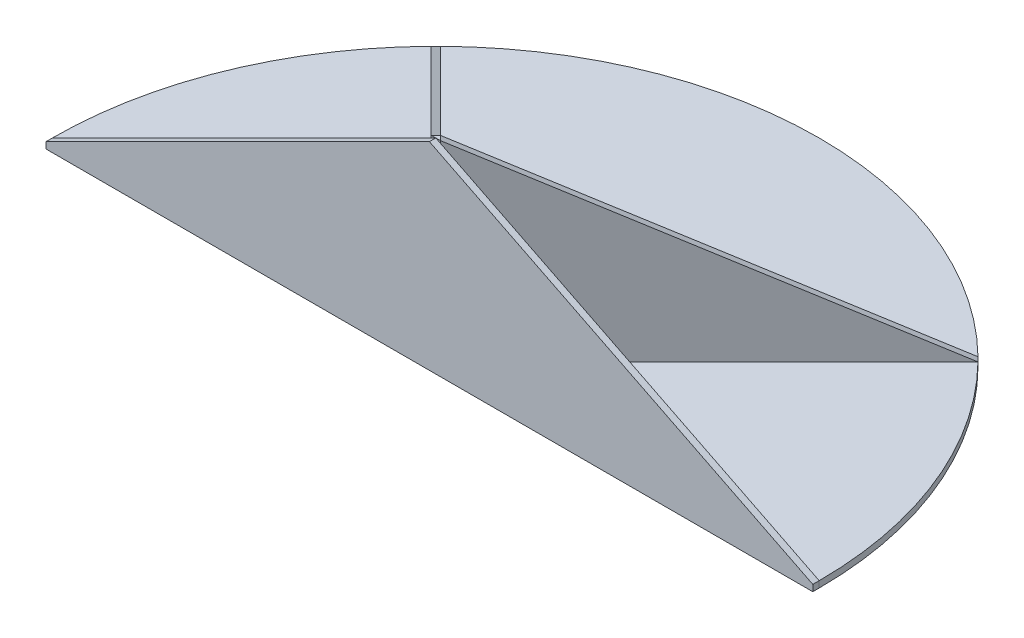
ISO-10303-21;
HEADER;
FILE_DESCRIPTION(('STEP AP214'),'2;1');
FILE_NAME('part.step','',(''),(''),'','','');
FILE_SCHEMA(('AUTOMOTIVE_DESIGN { 1 0 10303 214 1 1 1 1 }'));
ENDSEC;
DATA;
#1=APPLICATION_CONTEXT('core data for automotive mechanical design processes');
#2=APPLICATION_PROTOCOL_DEFINITION('international standard','automotive_design',2000,#1);
#3=PRODUCT_CONTEXT('',#1,'mechanical');
#4=PRODUCT('Part','Part','',(#3));
#5=PRODUCT_RELATED_PRODUCT_CATEGORY('part','',(#4));
#6=PRODUCT_DEFINITION_FORMATION('','',#4);
#7=PRODUCT_DEFINITION_CONTEXT('part definition',#1,'design');
#8=PRODUCT_DEFINITION('design','',#6,#7);
#9=PRODUCT_DEFINITION_SHAPE('','',#8);
#10=(LENGTH_UNIT() NAMED_UNIT(*) SI_UNIT(.MILLI.,.METRE.));
#11=(NAMED_UNIT(*) PLANE_ANGLE_UNIT() SI_UNIT($,.RADIAN.));
#12=(NAMED_UNIT(*) SI_UNIT($,.STERADIAN.) SOLID_ANGLE_UNIT());
#13=UNCERTAINTY_MEASURE_WITH_UNIT(LENGTH_MEASURE(1.E-05),#10,'distance_accuracy_value','');
#14=(GEOMETRIC_REPRESENTATION_CONTEXT(3) GLOBAL_UNCERTAINTY_ASSIGNED_CONTEXT((#13)) GLOBAL_UNIT_ASSIGNED_CONTEXT((#10,
#11,#12)) REPRESENTATION_CONTEXT('',''));
#15=CARTESIAN_POINT('',(0.,0.,0.));
#16=DIRECTION('',(0.,0.,1.));
#17=DIRECTION('',(1.,0.,0.));
#18=AXIS2_PLACEMENT_3D('',#15,#16,#17);
#19=CARTESIAN_POINT('',(0.,150.,0.));
#20=DIRECTION('',(0.,1.,0.));
#21=DIRECTION('',(0.,0.,1.));
#22=AXIS2_PLACEMENT_3D('',#19,#20,#21);
#23=PLANE('',#22);
#24=DIRECTION('',(0.707106781186546,0.,-0.707106781186549));
#25=VECTOR('',#24,1.);
#26=CARTESIAN_POINT('',(145.7312358923,150.,150.733260892299));
#27=LINE('',#26,#25);
#28=CARTESIAN_POINT('',(296.464496784599,150.,0.));
#29=VERTEX_POINT('',#28);
#30=CARTESIAN_POINT('',(299.999999999999,150.,-3.53550321540047));
#31=VERTEX_POINT('',#30);
#32=EDGE_CURVE('E562',#29,#31,#27,.T.);
#33=ORIENTED_EDGE('',*,*,#32,.F.);
#34=DIRECTION('',(1.,0.,0.));
#35=VECTOR('',#34,1.);
#36=CARTESIAN_POINT('',(0.,150.,0.));
#37=LINE('',#36,#35);
#38=CARTESIAN_POINT('',(300.,150.,0.));
#39=VERTEX_POINT('',#38);
#40=EDGE_CURVE('E87',#29,#39,#37,.T.);
#41=ORIENTED_EDGE('',*,*,#40,.T.);
#42=CARTESIAN_POINT('',(303.5355032154,150.,0.));
#43=VERTEX_POINT('',#42);
#44=EDGE_CURVE('E600',#39,#43,#37,.T.);
#45=ORIENTED_EDGE('',*,*,#44,.T.);
#46=DIRECTION('',(-0.707106781186549,0.,-0.707106781186546));
#47=VECTOR('',#46,1.);
#48=CARTESIAN_POINT('',(454.2687641077,150.,150.7332608923));
#49=LINE('',#48,#47);
#50=EDGE_CURVE('E554',#43,#31,#49,.T.);
#51=ORIENTED_EDGE('',*,*,#50,.T.);
#52=EDGE_LOOP('',(#33,#41,#45,#51));
#53=FACE_BOUND('',#52,.T.);
#54=ADVANCED_FACE('F36',(#53),#23,.T.);
#55=CARTESIAN_POINT('',(300.,0.,0.));
#56=DIRECTION('',(0.,-1.,0.));
#57=DIRECTION('',(0.,0.,-1.));
#58=AXIS2_PLACEMENT_3D('',#55,#56,#57);
#59=PLANE('',#58);
#60=DIRECTION('',(0.707106781186549,0.,0.707106781186546));
#61=VECTOR('',#60,1.);
#62=CARTESIAN_POINT('',(148.131566755635,0.,-148.131566755636));
#63=LINE('',#62,#61);
#64=CARTESIAN_POINT('',(86.0073295606741,0.,-210.255803950606));
#65=VERTEX_POINT('',#64);
#66=CARTESIAN_POINT('',(296.263133511271,0.,0.));
#67=VERTEX_POINT('',#66);
#68=EDGE_CURVE('E215',#65,#67,#63,.T.);
#69=ORIENTED_EDGE('',*,*,#68,.F.);
#70=CARTESIAN_POINT('',(300.,0.,0.));
#71=DIRECTION('',(0.,1.,0.));
#72=DIRECTION('',(0.,0.,-1.));
#73=AXIS2_PLACEMENT_3D('',#70,#71,#72);
#74=CIRCLE('',#73,300.);
#75=CARTESIAN_POINT('',(0.,0.,0.));
#76=VERTEX_POINT('',#75);
#77=EDGE_CURVE('E143',#65,#76,#74,.T.);
#78=ORIENTED_EDGE('',*,*,#77,.T.);
#79=DIRECTION('',(1.,0.,0.));
#80=VECTOR('',#79,1.);
#81=CARTESIAN_POINT('',(0.,0.,0.));
#82=LINE('',#81,#80);
#83=EDGE_CURVE('E145',#76,#67,#82,.T.);
#84=ORIENTED_EDGE('',*,*,#83,.T.);
#85=EDGE_LOOP('',(#69,#78,#84));
#86=FACE_BOUND('',#85,.T.);
#87=ADVANCED_FACE('F226',(#86),#59,.F.);
#88=CARTESIAN_POINT('',(600.,0.,0.));
#89=VERTEX_POINT('',#88);
#90=CARTESIAN_POINT('',(513.892420268064,0.,-210.356917052589));
#91=VERTEX_POINT('',#90);
#92=EDGE_CURVE('E159',#89,#91,#74,.T.);
#93=ORIENTED_EDGE('',*,*,#92,.T.);
#94=DIRECTION('',(-0.707106781186546,0.,0.707106781186549));
#95=VECTOR('',#94,1.);
#96=CARTESIAN_POINT('',(151.767751607701,0.,151.7677516077));
#97=LINE('',#96,#95);
#98=CARTESIAN_POINT('',(303.5355032154,0.,0.));
#99=VERTEX_POINT('',#98);
#100=EDGE_CURVE('E205',#91,#99,#97,.T.);
#101=ORIENTED_EDGE('',*,*,#100,.T.);
#102=EDGE_CURVE('E56',#99,#89,#82,.T.);
#103=ORIENTED_EDGE('',*,*,#102,.T.);
#104=EDGE_LOOP('',(#93,#101,#103));
#105=FACE_BOUND('',#104,.T.);
#106=ADVANCED_FACE('F206',(#105),#59,.F.);
#107=CARTESIAN_POINT('',(300.,0.,-15.));
#108=DIRECTION('',(0.,-1.,0.));
#109=DIRECTION('',(0.,0.,-1.));
#110=AXIS2_PLACEMENT_3D('',#107,#108,#109);
#111=CIRCLE('',#110,4.99999999999999);
#112=CARTESIAN_POINT('',(300.,0.,-20.));
#113=VERTEX_POINT('',#112);
#114=EDGE_CURVE('E624',#113,#113,#111,.F.);
#115=ORIENTED_EDGE('',*,*,#114,.F.);
#116=EDGE_LOOP('',(#115));
#117=FACE_BOUND('',#116,.T.);
#118=DIRECTION('',(-0.707106781186546,0.,0.707106781186549));
#119=VECTOR('',#118,1.);
#120=CARTESIAN_POINT('',(148.2322483923,0.,148.232248392299));
#121=LINE('',#120,#119);
#122=CARTESIAN_POINT('',(510.356917052626,0.,-213.892420268028));
#123=VERTEX_POINT('',#122);
#124=CARTESIAN_POINT('',(299.999999999999,0.,-3.53550321540041));
#125=VERTEX_POINT('',#124);
#126=EDGE_CURVE('E295',#123,#125,#121,.T.);
#127=ORIENTED_EDGE('',*,*,#126,.F.);
#128=CARTESIAN_POINT('',(89.6430829473671,0.,-213.892420268021));
#129=VERTEX_POINT('',#128);
#130=EDGE_CURVE('E155',#123,#129,#74,.T.);
#131=ORIENTED_EDGE('',*,*,#130,.T.);
#132=DIRECTION('',(0.707106781186549,0.,0.707106781186546));
#133=VECTOR('',#132,1.);
#134=CARTESIAN_POINT('',(151.767751607699,0.,-151.7677516077));
#135=LINE('',#134,#133);
#136=EDGE_CURVE('E292',#129,#125,#135,.T.);
#137=ORIENTED_EDGE('',*,*,#136,.T.);
#138=EDGE_LOOP('',(#127,#131,#137));
#139=FACE_BOUND('',#138,.T.);
#140=ADVANCED_FACE('F325',(#117,#139),#59,.F.);
#141=CARTESIAN_POINT('',(0.,0.,0.));
#142=DIRECTION('',(0.,0.,1.));
#143=DIRECTION('',(1.,0.,0.));
#144=AXIS2_PLACEMENT_3D('',#141,#142,#143);
#145=PLANE('',#144);
#146=DIRECTION('',(0.,-1.,0.));
#147=VECTOR('',#146,1.);
#148=CARTESIAN_POINT('',(296.263133511271,150.,0.));
#149=LINE('',#148,#147);
#150=CARTESIAN_POINT('',(296.263133511271,148.131566755636,0.));
#151=VERTEX_POINT('',#150);
#152=EDGE_CURVE('E238',#151,#67,#149,.T.);
#153=ORIENTED_EDGE('',*,*,#152,.T.);
#154=ORIENTED_EDGE('',*,*,#83,.F.);
#155=DIRECTION('',(-0.894427190999916,-0.447213595499958,0.));
#156=VECTOR('',#155,1.);
#157=CARTESIAN_POINT('',(300.,150.,0.));
#158=LINE('',#157,#156);
#159=EDGE_CURVE('E132',#151,#76,#158,.T.);
#160=ORIENTED_EDGE('',*,*,#159,.F.);
#161=EDGE_LOOP('',(#153,#154,#160));
#162=FACE_BOUND('',#161,.T.);
#163=ADVANCED_FACE('F236',(#162),#145,.F.);
#164=CARTESIAN_POINT('',(300.,-5.,0.));
#165=DIRECTION('',(0.,1.,0.));
#166=DIRECTION('',(0.,0.,1.));
#167=AXIS2_PLACEMENT_3D('',#164,#165,#166);
#168=CYLINDRICAL_SURFACE('',#167,300.);
#169=ORIENTED_EDGE('',*,*,#92,.F.);
#170=DIRECTION('',(0.,1.,0.));
#171=VECTOR('',#170,1.);
#172=CARTESIAN_POINT('',(600.,-5.,0.));
#173=LINE('',#172,#171);
#174=CARTESIAN_POINT('',(600.,-5.,0.));
#175=VERTEX_POINT('',#174);
#176=EDGE_CURVE('E11',#175,#89,#173,.T.);
#177=ORIENTED_EDGE('',*,*,#176,.F.);
#178=CARTESIAN_POINT('',(300.,-5.,0.));
#179=DIRECTION('',(0.,1.,0.));
#180=DIRECTION('',(0.,0.,-1.));
#181=AXIS2_PLACEMENT_3D('',#178,#179,#180);
#182=CIRCLE('',#181,300.);
#183=CARTESIAN_POINT('',(0.,-5.,0.));
#184=VERTEX_POINT('',#183);
#185=EDGE_CURVE('E115',#175,#184,#182,.T.);
#186=ORIENTED_EDGE('',*,*,#185,.T.);
#187=DIRECTION('',(0.,1.,0.));
#188=VECTOR('',#187,1.);
#189=CARTESIAN_POINT('',(0.,-5.,0.));
#190=LINE('',#189,#188);
#191=EDGE_CURVE('E48',#184,#76,#190,.T.);
#192=ORIENTED_EDGE('',*,*,#191,.T.);
#193=ORIENTED_EDGE('',*,*,#77,.F.);
#194=CARTESIAN_POINT('',(300.,0.,0.));
#195=DIRECTION('',(0.,-1.,0.));
#196=DIRECTION('',(-0.713307463246567,0.,-0.700851241617469));
#197=AXIS2_PLACEMENT_3D('',#194,#195,#196);
#198=CIRCLE('',#197,300.);
#199=CARTESIAN_POINT('',(86.1077780252574,0.,-210.356719713735));
#200=VERTEX_POINT('',#199);
#201=EDGE_CURVE('E248',#65,#200,#198,.T.);
#202=ORIENTED_EDGE('',*,*,#201,.T.);
#203=CARTESIAN_POINT('',(300.,0.,0.));
#204=DIRECTION('',(0.,-1.,0.));
#205=DIRECTION('',(-0.712974738098335,0.,-0.701189719572108));
#206=AXIS2_PLACEMENT_3D('',#203,#204,#205);
#207=CIRCLE('',#206,300.);
#208=CARTESIAN_POINT('',(86.1926777252267,0.,-210.442709888448));
#209=VERTEX_POINT('',#208);
#210=EDGE_CURVE('E555',#200,#209,#207,.T.);
#211=ORIENTED_EDGE('',*,*,#210,.T.);
#212=CARTESIAN_POINT('',(87.7673042066446,0.,-212.031325129767));
#213=DIRECTION('',(-0.703817272243144,0.,0.710381057807864));
#214=VECTOR('',#213,1.);
#215=LINE('',#212,#214);
#216=CARTESIAN_POINT('',(87.7673042066445,0.,-212.031325129767));
#217=VERTEX_POINT('',#216);
#218=EDGE_CURVE('E305',#217,#209,#215,.T.);
#219=ORIENTED_EDGE('',*,*,#218,.F.);
#220=CARTESIAN_POINT('',(300.,0.,0.));
#221=DIRECTION('',(0.,-1.,0.));
#222=DIRECTION('',(-0.707442319311179,0.,-0.706771083765897));
#223=AXIS2_PLACEMENT_3D('',#220,#221,#222);
#224=CIRCLE('',#223,300.);
#225=EDGE_CURVE('E167',#217,#129,#224,.T.);
#226=ORIENTED_EDGE('',*,*,#225,.T.);
#227=ORIENTED_EDGE('',*,*,#130,.F.);
#228=CARTESIAN_POINT('',(512.132034355963,0.,-212.132034355966));
#229=DIRECTION('',(-0.710046921335167,0.,-0.70415436482525));
#230=VECTOR('',#229,1.);
#231=LINE('',#228,#230);
#232=CARTESIAN_POINT('',(512.132034355963,0.,-212.132034355966));
#233=VERTEX_POINT('',#232);
#234=EDGE_CURVE('E181',#233,#123,#231,.T.);
#235=ORIENTED_EDGE('',*,*,#234,.F.);
#236=CARTESIAN_POINT('',(300.,0.,0.));
#237=DIRECTION('',(0.,-1.,0.));
#238=DIRECTION('',(0.707106781186556,0.,-0.707106781186539));
#239=AXIS2_PLACEMENT_3D('',#236,#237,#238);
#240=CIRCLE('',#239,300.);
#241=EDGE_CURVE('E193',#233,#91,#240,.T.);
#242=ORIENTED_EDGE('',*,*,#241,.T.);
#243=EDGE_LOOP('',(#169,#177,#186,#192,#193,#202,#211,#219,#226,#227,#235,#242));
#244=FACE_BOUND('',#243,.T.);
#245=ADVANCED_FACE('F38',(#244),#168,.T.);
#246=CARTESIAN_POINT('',(300.,-5.,0.));
#247=DIRECTION('',(0.,-1.,0.));
#248=DIRECTION('',(0.,0.,-1.));
#249=AXIS2_PLACEMENT_3D('',#246,#247,#248);
#250=PLANE('',#249);
#251=CARTESIAN_POINT('',(300.,-5.,-15.));
#252=DIRECTION('',(0.,-1.,0.));
#253=DIRECTION('',(0.,0.,-1.));
#254=AXIS2_PLACEMENT_3D('',#251,#252,#253);
#255=CIRCLE('',#254,4.99999999999999);
#256=CARTESIAN_POINT('',(300.,-5.,-20.));
#257=VERTEX_POINT('',#256);
#258=EDGE_CURVE('E626',#257,#257,#255,.T.);
#259=ORIENTED_EDGE('',*,*,#258,.F.);
#260=EDGE_LOOP('',(#259));
#261=FACE_BOUND('',#260,.T.);
#262=ORIENTED_EDGE('',*,*,#185,.F.);
#263=DIRECTION('',(0.,0.,-1.));
#264=VECTOR('',#263,1.);
#265=CARTESIAN_POINT('',(600.,-5.,5.));
#266=LINE('',#265,#264);
#267=CARTESIAN_POINT('',(600.,-5.,5.));
#268=VERTEX_POINT('',#267);
#269=EDGE_CURVE('E112',#268,#175,#266,.T.);
#270=ORIENTED_EDGE('',*,*,#269,.F.);
#271=DIRECTION('',(1.,0.,0.));
#272=VECTOR('',#271,1.);
#273=CARTESIAN_POINT('',(600.,-5.,5.));
#274=LINE('',#273,#272);
#275=CARTESIAN_POINT('',(0.,-5.,5.));
#276=VERTEX_POINT('',#275);
#277=EDGE_CURVE('E102',#276,#268,#274,.T.);
#278=ORIENTED_EDGE('',*,*,#277,.F.);
#279=DIRECTION('',(0.,0.,-1.));
#280=VECTOR('',#279,1.);
#281=CARTESIAN_POINT('',(0.,-5.,5.));
#282=LINE('',#281,#280);
#283=EDGE_CURVE('E118',#276,#184,#282,.T.);
#284=ORIENTED_EDGE('',*,*,#283,.T.);
#285=EDGE_LOOP('',(#262,#270,#278,#284));
#286=FACE_BOUND('',#285,.T.);
#287=ADVANCED_FACE('F113',(#261,#286),#250,.T.);
#288=ORIENTED_EDGE('',*,*,#102,.F.);
#289=DIRECTION('',(0.,-1.,0.));
#290=VECTOR('',#289,1.);
#291=CARTESIAN_POINT('',(303.5355032154,150.,0.));
#292=LINE('',#291,#290);
#293=CARTESIAN_POINT('',(303.5355032154,148.2322483923,0.));
#294=VERTEX_POINT('',#293);
#295=EDGE_CURVE('E221',#294,#99,#292,.T.);
#296=ORIENTED_EDGE('',*,*,#295,.F.);
#297=DIRECTION('',(-0.894427190999916,0.447213595499958,0.));
#298=VECTOR('',#297,1.);
#299=CARTESIAN_POINT('',(300.,150.,0.));
#300=LINE('',#299,#298);
#301=EDGE_CURVE('E133',#89,#294,#300,.T.);
#302=ORIENTED_EDGE('',*,*,#301,.F.);
#303=EDGE_LOOP('',(#288,#296,#302));
#304=FACE_BOUND('',#303,.T.);
#305=ADVANCED_FACE('F219',(#304),#145,.F.);
#306=CARTESIAN_POINT('',(300.,150.,5.));
#307=DIRECTION('',(0.447213595499958,-0.894427190999916,0.));
#308=DIRECTION('',(0.894427190999916,0.447213595499958,0.));
#309=AXIS2_PLACEMENT_3D('',#306,#307,#308);
#310=PLANE('',#309);
#311=EDGE_CURVE('E128',#39,#151,#158,.T.);
#312=ORIENTED_EDGE('',*,*,#311,.T.);
#313=ORIENTED_EDGE('',*,*,#159,.T.);
#314=DIRECTION('',(0.,0.,-1.));
#315=VECTOR('',#314,1.);
#316=CARTESIAN_POINT('',(0.,0.,5.));
#317=LINE('',#316,#315);
#318=CARTESIAN_POINT('',(0.,0.,5.));
#319=VERTEX_POINT('',#318);
#320=EDGE_CURVE('E141',#319,#76,#317,.T.);
#321=ORIENTED_EDGE('',*,*,#320,.F.);
#322=DIRECTION('',(-0.894427190999916,-0.447213595499958,0.));
#323=VECTOR('',#322,1.);
#324=CARTESIAN_POINT('',(300.,150.,5.));
#325=LINE('',#324,#323);
#326=CARTESIAN_POINT('',(300.,150.,5.));
#327=VERTEX_POINT('',#326);
#328=EDGE_CURVE('E136',#327,#319,#325,.T.);
#329=ORIENTED_EDGE('',*,*,#328,.F.);
#330=DIRECTION('',(0.,0.,-1.));
#331=VECTOR('',#330,1.);
#332=CARTESIAN_POINT('',(300.,150.,5.));
#333=LINE('',#332,#331);
#334=EDGE_CURVE('E124',#327,#39,#333,.T.);
#335=ORIENTED_EDGE('',*,*,#334,.T.);
#336=EDGE_LOOP('',(#312,#313,#321,#329,#335));
#337=FACE_BOUND('',#336,.T.);
#338=ADVANCED_FACE('F308',(#337),#310,.F.);
#339=CARTESIAN_POINT('',(0.,0.,5.));
#340=DIRECTION('',(1.,0.,0.));
#341=DIRECTION('',(0.,0.,-1.));
#342=AXIS2_PLACEMENT_3D('',#339,#340,#341);
#343=PLANE('',#342);
#344=ORIENTED_EDGE('',*,*,#191,.F.);
#345=ORIENTED_EDGE('',*,*,#283,.F.);
#346=DIRECTION('',(0.,-1.,0.));
#347=VECTOR('',#346,1.);
#348=CARTESIAN_POINT('',(0.,0.,5.));
#349=LINE('',#348,#347);
#350=EDGE_CURVE('E96',#319,#276,#349,.T.);
#351=ORIENTED_EDGE('',*,*,#350,.F.);
#352=ORIENTED_EDGE('',*,*,#320,.T.);
#353=EDGE_LOOP('',(#344,#345,#351,#352));
#354=FACE_BOUND('',#353,.T.);
#355=ADVANCED_FACE('F241',(#354),#343,.F.);
#356=CARTESIAN_POINT('',(600.,0.,5.));
#357=DIRECTION('',(-1.,0.,0.));
#358=DIRECTION('',(0.,0.,1.));
#359=AXIS2_PLACEMENT_3D('',#356,#357,#358);
#360=PLANE('',#359);
#361=ORIENTED_EDGE('',*,*,#176,.T.);
#362=DIRECTION('',(0.,0.,-1.));
#363=VECTOR('',#362,1.);
#364=CARTESIAN_POINT('',(600.,0.,5.));
#365=LINE('',#364,#363);
#366=CARTESIAN_POINT('',(600.,0.,5.));
#367=VERTEX_POINT('',#366);
#368=EDGE_CURVE('E119',#367,#89,#365,.T.);
#369=ORIENTED_EDGE('',*,*,#368,.F.);
#370=DIRECTION('',(0.,1.,0.));
#371=VECTOR('',#370,1.);
#372=CARTESIAN_POINT('',(600.,0.,5.));
#373=LINE('',#372,#371);
#374=EDGE_CURVE('E106',#268,#367,#373,.T.);
#375=ORIENTED_EDGE('',*,*,#374,.F.);
#376=ORIENTED_EDGE('',*,*,#269,.T.);
#377=EDGE_LOOP('',(#361,#369,#375,#376));
#378=FACE_BOUND('',#377,.T.);
#379=ADVANCED_FACE('F121',(#378),#360,.F.);
#380=CARTESIAN_POINT('',(300.,150.,5.));
#381=DIRECTION('',(-0.447213595499958,-0.894427190999916,0.));
#382=DIRECTION('',(0.894427190999916,-0.447213595499958,0.));
#383=AXIS2_PLACEMENT_3D('',#380,#381,#382);
#384=PLANE('',#383);
#385=ORIENTED_EDGE('',*,*,#301,.T.);
#386=EDGE_CURVE('E131',#294,#39,#300,.T.);
#387=ORIENTED_EDGE('',*,*,#386,.T.);
#388=ORIENTED_EDGE('',*,*,#334,.F.);
#389=DIRECTION('',(-0.894427190999916,0.447213595499958,0.));
#390=VECTOR('',#389,1.);
#391=CARTESIAN_POINT('',(300.,150.,5.));
#392=LINE('',#391,#390);
#393=EDGE_CURVE('E65',#367,#327,#392,.T.);
#394=ORIENTED_EDGE('',*,*,#393,.F.);
#395=ORIENTED_EDGE('',*,*,#368,.T.);
#396=EDGE_LOOP('',(#385,#387,#388,#394,#395));
#397=FACE_BOUND('',#396,.T.);
#398=ADVANCED_FACE('F310',(#397),#384,.F.);
#399=CARTESIAN_POINT('',(0.,0.,5.));
#400=DIRECTION('',(0.,0.,1.));
#401=DIRECTION('',(1.,0.,0.));
#402=AXIS2_PLACEMENT_3D('',#399,#400,#401);
#403=PLANE('',#402);
#404=ORIENTED_EDGE('',*,*,#328,.T.);
#405=ORIENTED_EDGE('',*,*,#350,.T.);
#406=ORIENTED_EDGE('',*,*,#277,.T.);
#407=ORIENTED_EDGE('',*,*,#374,.T.);
#408=ORIENTED_EDGE('',*,*,#393,.T.);
#409=EDGE_LOOP('',(#404,#405,#406,#407,#408));
#410=FACE_BOUND('',#409,.T.);
#411=ADVANCED_FACE('F104',(#410),#403,.T.);
#412=CARTESIAN_POINT('',(0.,150.,0.));
#413=DIRECTION('',(0.,0.,-1.));
#414=DIRECTION('',(-1.,0.,0.));
#415=AXIS2_PLACEMENT_3D('',#412,#413,#414);
#416=PLANE('',#415);
#417=ORIENTED_EDGE('',*,*,#40,.F.);
#418=DIRECTION('',(0.941922565141139,0.335830137536728,0.));
#419=VECTOR('',#418,1.);
#420=CARTESIAN_POINT('',(162.731216626892,102.31915283623,0.));
#421=LINE('',#420,#419);
#422=CARTESIAN_POINT('',(296.263133511271,149.928206565721,0.));
#423=VERTEX_POINT('',#422);
#424=EDGE_CURVE('E284',#423,#29,#421,.T.);
#425=ORIENTED_EDGE('',*,*,#424,.F.);
#426=EDGE_CURVE('E281',#423,#151,#149,.T.);
#427=ORIENTED_EDGE('',*,*,#426,.T.);
#428=ORIENTED_EDGE('',*,*,#311,.F.);
#429=EDGE_LOOP('',(#417,#425,#427,#428));
#430=FACE_BOUND('',#429,.T.);
#431=ADVANCED_FACE('F282',(#430),#416,.F.);
#432=ORIENTED_EDGE('',*,*,#44,.F.);
#433=ORIENTED_EDGE('',*,*,#386,.F.);
#434=EDGE_CURVE('E288',#43,#294,#292,.T.);
#435=ORIENTED_EDGE('',*,*,#434,.F.);
#436=EDGE_LOOP('',(#432,#433,#435));
#437=FACE_BOUND('',#436,.T.);
#438=ADVANCED_FACE('F343',(#437),#416,.F.);
#439=CARTESIAN_POINT('',(148.131566755635,150.,-148.131566755636));
#440=DIRECTION('',(0.707106781186546,0.,-0.707106781186549));
#441=DIRECTION('',(-0.707106781186549,0.,-0.707106781186546));
#442=AXIS2_PLACEMENT_3D('',#439,#440,#441);
#443=PLANE('',#442);
#444=ORIENTED_EDGE('',*,*,#426,.F.);
#445=DIRECTION('',(0.631386338221898,0.45022503685767,0.631386338221895));
#446=VECTOR('',#445,1.);
#447=CARTESIAN_POINT('',(296.363815147935,150.,0.100681636663741));
#448=LINE('',#447,#446);
#449=EDGE_CURVE('E561',#65,#423,#448,.T.);
#450=ORIENTED_EDGE('',*,*,#449,.F.);
#451=ORIENTED_EDGE('',*,*,#68,.T.);
#452=ORIENTED_EDGE('',*,*,#152,.F.);
#453=EDGE_LOOP('',(#444,#450,#451,#452));
#454=FACE_BOUND('',#453,.T.);
#455=ADVANCED_FACE('F287',(#454),#443,.F.);
#456=CARTESIAN_POINT('',(151.767751607701,150.,151.7677516077));
#457=DIRECTION('',(0.707106781186549,0.,0.707106781186546));
#458=DIRECTION('',(0.707106781186546,0.,-0.707106781186549));
#459=AXIS2_PLACEMENT_3D('',#456,#457,#458);
#460=PLANE('',#459);
#461=DIRECTION('',(-0.631386338221896,0.450225036857668,0.631386338221898));
#462=VECTOR('',#461,1.);
#463=CARTESIAN_POINT('',(303.5355032154,150.,1.11022302462516E-13));
#464=LINE('',#463,#462);
#465=EDGE_CURVE('E582',#91,#43,#464,.T.);
#466=ORIENTED_EDGE('',*,*,#465,.T.);
#467=ORIENTED_EDGE('',*,*,#434,.T.);
#468=ORIENTED_EDGE('',*,*,#295,.T.);
#469=ORIENTED_EDGE('',*,*,#100,.F.);
#470=EDGE_LOOP('',(#466,#467,#468,#469));
#471=FACE_BOUND('',#470,.T.);
#472=ADVANCED_FACE('F337',(#471),#460,.T.);
#473=CARTESIAN_POINT('',(148.2322483923,150.,148.232248392299));
#474=DIRECTION('',(0.707106781186549,0.,0.707106781186546));
#475=DIRECTION('',(0.707106781186546,0.,-0.707106781186549));
#476=AXIS2_PLACEMENT_3D('',#473,#474,#475);
#477=PLANE('',#476);
#478=DIRECTION('',(0.,-1.,0.));
#479=VECTOR('',#478,1.);
#480=CARTESIAN_POINT('',(299.999999999999,150.,-3.53550321540041));
#481=LINE('',#480,#479);
#482=EDGE_CURVE('E599',#31,#125,#481,.T.);
#483=ORIENTED_EDGE('',*,*,#482,.F.);
#484=DIRECTION('',(-0.631386338221896,0.450225036857668,0.631386338221898));
#485=VECTOR('',#484,1.);
#486=CARTESIAN_POINT('',(299.999999999999,150.,-3.53550321540036));
#487=LINE('',#486,#485);
#488=EDGE_CURVE('E572',#123,#31,#487,.T.);
#489=ORIENTED_EDGE('',*,*,#488,.F.);
#490=ORIENTED_EDGE('',*,*,#126,.T.);
#491=EDGE_LOOP('',(#483,#489,#490));
#492=FACE_BOUND('',#491,.T.);
#493=ADVANCED_FACE('F333',(#492),#477,.F.);
#494=CARTESIAN_POINT('',(151.767751607699,150.,-151.7677516077));
#495=DIRECTION('',(0.707106781186546,0.,-0.707106781186549));
#496=DIRECTION('',(-0.707106781186549,0.,-0.707106781186546));
#497=AXIS2_PLACEMENT_3D('',#494,#495,#496);
#498=PLANE('',#497);
#499=DIRECTION('',(-0.631386338221897,-0.45022503685767,-0.631386338221895));
#500=VECTOR('',#499,1.);
#501=CARTESIAN_POINT('',(299.999999999999,150.,-3.53550321540047));
#502=LINE('',#501,#500);
#503=EDGE_CURVE('E559',#31,#129,#502,.T.);
#504=ORIENTED_EDGE('',*,*,#503,.F.);
#505=ORIENTED_EDGE('',*,*,#482,.T.);
#506=ORIENTED_EDGE('',*,*,#136,.F.);
#507=EDGE_LOOP('',(#504,#505,#506));
#508=FACE_BOUND('',#507,.T.);
#509=ADVANCED_FACE('F330',(#508),#498,.T.);
#510=CARTESIAN_POINT('',(454.2687641077,150.,150.7332608923));
#511=DIRECTION('',(-0.31835717662202,-0.892915122610493,0.318357176622021));
#512=DIRECTION('',(0.,-0.335830137536727,-0.941922565141139));
#513=AXIS2_PLACEMENT_3D('',#510,#511,#512);
#514=PLANE('',#513);
#515=DIRECTION('',(-0.707106781186549,0.,-0.707106781186546));
#516=VECTOR('',#515,1.);
#517=CARTESIAN_POINT('',(664.625681160327,0.,-59.6236561603272));
#518=LINE('',#517,#516);
#519=EDGE_CURVE('E581',#91,#123,#518,.T.);
#520=ORIENTED_EDGE('',*,*,#519,.T.);
#521=ORIENTED_EDGE('',*,*,#488,.T.);
#522=ORIENTED_EDGE('',*,*,#50,.F.);
#523=ORIENTED_EDGE('',*,*,#465,.F.);
#524=EDGE_LOOP('',(#520,#521,#522,#523));
#525=FACE_BOUND('',#524,.T.);
#526=ADVANCED_FACE('F328',(#525),#514,.F.);
#527=CARTESIAN_POINT('',(145.7312358923,150.,150.733260892299));
#528=DIRECTION('',(0.318357176622022,-0.892915122610492,0.318357176622021));
#529=DIRECTION('',(0.941922565141139,0.335830137536728,0.));
#530=AXIS2_PLACEMENT_3D('',#527,#528,#529);
#531=PLANE('',#530);
#532=ORIENTED_EDGE('',*,*,#424,.T.);
#533=ORIENTED_EDGE('',*,*,#32,.T.);
#534=ORIENTED_EDGE('',*,*,#503,.T.);
#535=DIRECTION('',(0.707106781186546,0.,-0.707106781186549));
#536=VECTOR('',#535,1.);
#537=CARTESIAN_POINT('',(-64.6256811603268,0.,-59.6236561603266));
#538=LINE('',#537,#536);
#539=EDGE_CURVE('E551',#209,#129,#538,.T.);
#540=ORIENTED_EDGE('',*,*,#539,.F.);
#541=ORIENTED_EDGE('',*,*,#210,.F.);
#542=ORIENTED_EDGE('',*,*,#201,.F.);
#543=ORIENTED_EDGE('',*,*,#449,.T.);
#544=EDGE_LOOP('',(#532,#533,#534,#540,#541,#542,#543));
#545=FACE_BOUND('',#544,.T.);
#546=ADVANCED_FACE('F470',(#545),#531,.F.);
#547=CARTESIAN_POINT('',(151.411682061985,0.,155.157159211597));
#548=DIRECTION('',(0.,-1.,0.));
#549=DIRECTION('',(0.,0.,-1.));
#550=AXIS2_PLACEMENT_3D('',#547,#548,#549);
#551=PLANE('',#550);
#552=ORIENTED_EDGE('',*,*,#234,.T.);
#553=ORIENTED_EDGE('',*,*,#519,.F.);
#554=ORIENTED_EDGE('',*,*,#241,.F.);
#555=EDGE_LOOP('',(#552,#553,#554));
#556=FACE_BOUND('',#555,.T.);
#557=ADVANCED_FACE('F476',(#556),#551,.F.);
#558=CARTESIAN_POINT('',(300.143338858734,0.,302.511399137255));
#559=DIRECTION('',(0.,1.,0.));
#560=DIRECTION('',(0.,0.,1.));
#561=AXIS2_PLACEMENT_3D('',#558,#559,#560);
#562=PLANE('',#561);
#563=ORIENTED_EDGE('',*,*,#539,.T.);
#564=ORIENTED_EDGE('',*,*,#225,.F.);
#565=ORIENTED_EDGE('',*,*,#218,.T.);
#566=EDGE_LOOP('',(#563,#564,#565));
#567=FACE_BOUND('',#566,.T.);
#568=ADVANCED_FACE('F481',(#567),#562,.T.);
#569=CARTESIAN_POINT('',(300.,14.1421356237309,-15.));
#570=DIRECTION('',(0.,-1.,0.));
#571=DIRECTION('',(0.,0.,-1.));
#572=AXIS2_PLACEMENT_3D('',#569,#570,#571);
#573=CYLINDRICAL_SURFACE('',#572,4.99999999999999);
#574=ORIENTED_EDGE('',*,*,#114,.T.);
#575=EDGE_LOOP('',(#574));
#576=FACE_BOUND('',#575,.T.);
#577=ORIENTED_EDGE('',*,*,#258,.T.);
#578=EDGE_LOOP('',(#577));
#579=FACE_BOUND('',#578,.T.);
#580=ADVANCED_FACE('F512',(#576,#579),#573,.F.);
#581=CLOSED_SHELL('',(#54,#87,#106,#140,#163,#245,#287,#305,#338,#355,#379,#398,#411,#431,#438,
#455,#472,#493,#509,#526,#546,#557,#568,#580));
#582=MANIFOLD_SOLID_BREP('B2',#581);
#583=ADVANCED_BREP_SHAPE_REPRESENTATION('',(#18,#582),#14);
#584=SHAPE_DEFINITION_REPRESENTATION(#9,#583);
ENDSEC;
END-ISO-10303-21;
